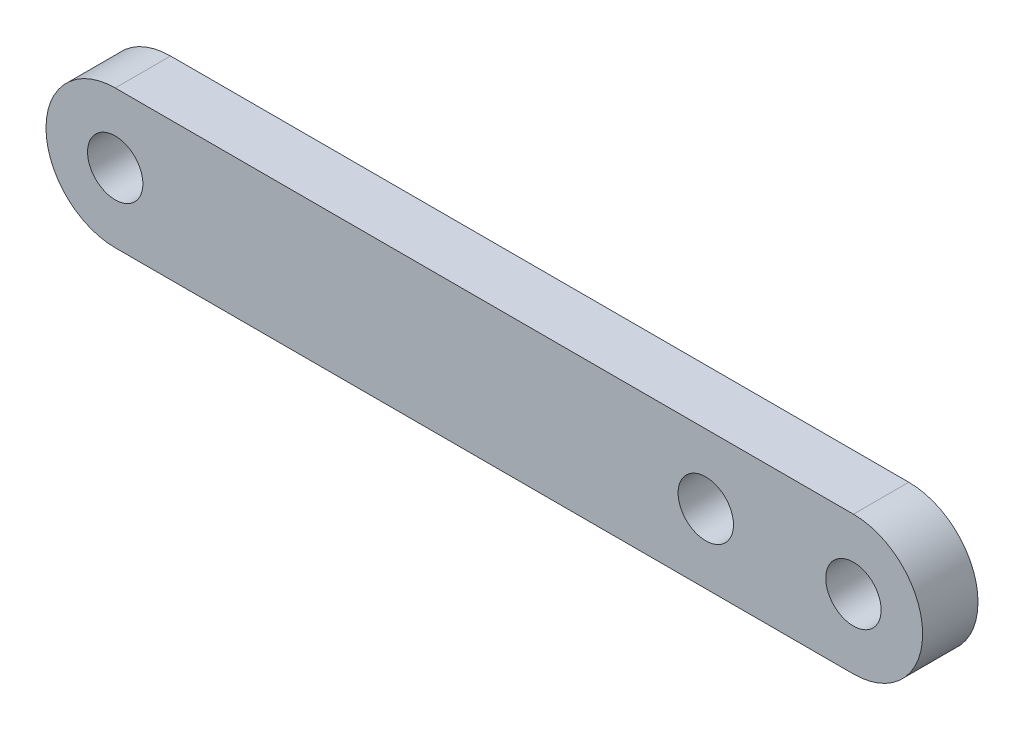
ISO-10303-21;
HEADER;
FILE_DESCRIPTION(('STEP AP214'),'2;1');
FILE_NAME('part.step','',(''),(''),'','','');
FILE_SCHEMA(('AUTOMOTIVE_DESIGN { 1 0 10303 214 1 1 1 1 }'));
ENDSEC;
DATA;
#1=APPLICATION_CONTEXT('core data for automotive mechanical design processes');
#2=APPLICATION_PROTOCOL_DEFINITION('international standard','automotive_design',2000,#1);
#3=PRODUCT_CONTEXT('',#1,'mechanical');
#4=PRODUCT('Part','Part','',(#3));
#5=PRODUCT_RELATED_PRODUCT_CATEGORY('part','',(#4));
#6=PRODUCT_DEFINITION_FORMATION('','',#4);
#7=PRODUCT_DEFINITION_CONTEXT('part definition',#1,'design');
#8=PRODUCT_DEFINITION('design','',#6,#7);
#9=PRODUCT_DEFINITION_SHAPE('','',#8);
#10=(LENGTH_UNIT() NAMED_UNIT(*) SI_UNIT(.MILLI.,.METRE.));
#11=(NAMED_UNIT(*) PLANE_ANGLE_UNIT() SI_UNIT($,.RADIAN.));
#12=(NAMED_UNIT(*) SI_UNIT($,.STERADIAN.) SOLID_ANGLE_UNIT());
#13=UNCERTAINTY_MEASURE_WITH_UNIT(LENGTH_MEASURE(1.E-05),#10,'distance_accuracy_value','');
#14=(GEOMETRIC_REPRESENTATION_CONTEXT(3) GLOBAL_UNCERTAINTY_ASSIGNED_CONTEXT((#13)) GLOBAL_UNIT_ASSIGNED_CONTEXT((#10,
#11,#12)) REPRESENTATION_CONTEXT('',''));
#15=CARTESIAN_POINT('',(0.,0.,0.));
#16=DIRECTION('',(0.,0.,1.));
#17=DIRECTION('',(1.,0.,0.));
#18=AXIS2_PLACEMENT_3D('',#15,#16,#17);
#19=CARTESIAN_POINT('',(0.,-3.75,3.));
#20=DIRECTION('',(0.,-1.,0.));
#21=DIRECTION('',(1.,0.,0.));
#22=AXIS2_PLACEMENT_3D('',#19,#20,#21);
#23=PLANE('',#22);
#24=DIRECTION('',(-1.,0.,0.));
#25=VECTOR('',#24,1.);
#26=CARTESIAN_POINT('',(0.,-3.75,0.));
#27=LINE('',#26,#25);
#28=CARTESIAN_POINT('',(40.,-3.75,0.));
#29=VERTEX_POINT('',#28);
#30=CARTESIAN_POINT('',(0.,-3.75,0.));
#31=VERTEX_POINT('',#30);
#32=EDGE_CURVE('E124',#29,#31,#27,.T.);
#33=ORIENTED_EDGE('',*,*,#32,.F.);
#34=DIRECTION('',(0.,0.,-1.));
#35=VECTOR('',#34,1.);
#36=CARTESIAN_POINT('',(40.,-3.75,3.));
#37=LINE('',#36,#35);
#38=CARTESIAN_POINT('',(40.,-3.75,3.));
#39=VERTEX_POINT('',#38);
#40=EDGE_CURVE('E11',#39,#29,#37,.T.);
#41=ORIENTED_EDGE('',*,*,#40,.F.);
#42=DIRECTION('',(-1.,0.,0.));
#43=VECTOR('',#42,1.);
#44=CARTESIAN_POINT('',(0.,-3.75,3.));
#45=LINE('',#44,#43);
#46=CARTESIAN_POINT('',(0.,-3.75,3.));
#47=VERTEX_POINT('',#46);
#48=EDGE_CURVE('E93',#39,#47,#45,.T.);
#49=ORIENTED_EDGE('',*,*,#48,.T.);
#50=DIRECTION('',(0.,0.,-1.));
#51=VECTOR('',#50,1.);
#52=CARTESIAN_POINT('',(0.,-3.75,3.));
#53=LINE('',#52,#51);
#54=EDGE_CURVE('E82',#47,#31,#53,.T.);
#55=ORIENTED_EDGE('',*,*,#54,.T.);
#56=EDGE_LOOP('',(#33,#41,#49,#55));
#57=FACE_BOUND('',#56,.T.);
#58=ADVANCED_FACE('F43',(#57),#23,.T.);
#59=CARTESIAN_POINT('',(40.,0.,3.));
#60=DIRECTION('',(0.,0.,-1.));
#61=DIRECTION('',(-1.,0.,0.));
#62=AXIS2_PLACEMENT_3D('',#59,#60,#61);
#63=CYLINDRICAL_SURFACE('',#62,3.75);
#64=CARTESIAN_POINT('',(40.,0.,0.));
#65=DIRECTION('',(0.,0.,1.));
#66=DIRECTION('',(1.,0.,0.));
#67=AXIS2_PLACEMENT_3D('',#64,#65,#66);
#68=CIRCLE('',#67,3.75);
#69=CARTESIAN_POINT('',(40.,3.75,0.));
#70=VERTEX_POINT('',#69);
#71=EDGE_CURVE('E100',#29,#70,#68,.T.);
#72=ORIENTED_EDGE('',*,*,#71,.T.);
#73=DIRECTION('',(0.,0.,-1.));
#74=VECTOR('',#73,1.);
#75=CARTESIAN_POINT('',(40.,3.75,3.));
#76=LINE('',#75,#74);
#77=CARTESIAN_POINT('',(40.,3.75,3.));
#78=VERTEX_POINT('',#77);
#79=EDGE_CURVE('E52',#78,#70,#76,.T.);
#80=ORIENTED_EDGE('',*,*,#79,.F.);
#81=CARTESIAN_POINT('',(40.,0.,3.));
#82=DIRECTION('',(0.,0.,1.));
#83=DIRECTION('',(1.,0.,0.));
#84=AXIS2_PLACEMENT_3D('',#81,#82,#83);
#85=CIRCLE('',#84,3.75);
#86=EDGE_CURVE('E87',#39,#78,#85,.T.);
#87=ORIENTED_EDGE('',*,*,#86,.F.);
#88=ORIENTED_EDGE('',*,*,#40,.T.);
#89=EDGE_LOOP('',(#72,#80,#87,#88));
#90=FACE_BOUND('',#89,.T.);
#91=ADVANCED_FACE('F98',(#90),#63,.T.);
#92=CARTESIAN_POINT('',(0.,3.75,3.));
#93=DIRECTION('',(0.,1.,0.));
#94=DIRECTION('',(-1.,0.,0.));
#95=AXIS2_PLACEMENT_3D('',#92,#93,#94);
#96=PLANE('',#95);
#97=DIRECTION('',(1.,0.,0.));
#98=VECTOR('',#97,1.);
#99=CARTESIAN_POINT('',(0.,3.75,0.));
#100=LINE('',#99,#98);
#101=CARTESIAN_POINT('',(0.,3.75,0.));
#102=VERTEX_POINT('',#101);
#103=EDGE_CURVE('E130',#102,#70,#100,.T.);
#104=ORIENTED_EDGE('',*,*,#103,.F.);
#105=DIRECTION('',(0.,0.,-1.));
#106=VECTOR('',#105,1.);
#107=CARTESIAN_POINT('',(0.,3.75,3.));
#108=LINE('',#107,#106);
#109=CARTESIAN_POINT('',(0.,3.75,3.));
#110=VERTEX_POINT('',#109);
#111=EDGE_CURVE('E75',#110,#102,#108,.T.);
#112=ORIENTED_EDGE('',*,*,#111,.F.);
#113=DIRECTION('',(1.,0.,0.));
#114=VECTOR('',#113,1.);
#115=CARTESIAN_POINT('',(0.,3.75,3.));
#116=LINE('',#115,#114);
#117=EDGE_CURVE('E92',#110,#78,#116,.T.);
#118=ORIENTED_EDGE('',*,*,#117,.T.);
#119=ORIENTED_EDGE('',*,*,#79,.T.);
#120=EDGE_LOOP('',(#104,#112,#118,#119));
#121=FACE_BOUND('',#120,.T.);
#122=ADVANCED_FACE('F105',(#121),#96,.T.);
#123=CARTESIAN_POINT('',(0.,0.,3.));
#124=DIRECTION('',(0.,0.,-1.));
#125=DIRECTION('',(-1.,0.,0.));
#126=AXIS2_PLACEMENT_3D('',#123,#124,#125);
#127=CYLINDRICAL_SURFACE('',#126,1.5);
#128=CARTESIAN_POINT('',(0.,0.,3.));
#129=DIRECTION('',(0.,0.,1.));
#130=DIRECTION('',(1.,0.,0.));
#131=AXIS2_PLACEMENT_3D('',#128,#129,#130);
#132=CIRCLE('',#131,1.5);
#133=CARTESIAN_POINT('',(1.5,0.,3.));
#134=VERTEX_POINT('',#133);
#135=EDGE_CURVE('E116',#134,#134,#132,.T.);
#136=ORIENTED_EDGE('',*,*,#135,.T.);
#137=EDGE_LOOP('',(#136));
#138=FACE_BOUND('',#137,.T.);
#139=CARTESIAN_POINT('',(0.,0.,0.));
#140=DIRECTION('',(0.,0.,1.));
#141=DIRECTION('',(1.,0.,0.));
#142=AXIS2_PLACEMENT_3D('',#139,#140,#141);
#143=CIRCLE('',#142,1.5);
#144=CARTESIAN_POINT('',(1.5,0.,0.));
#145=VERTEX_POINT('',#144);
#146=EDGE_CURVE('E140',#145,#145,#143,.T.);
#147=ORIENTED_EDGE('',*,*,#146,.F.);
#148=EDGE_LOOP('',(#147));
#149=FACE_BOUND('',#148,.T.);
#150=ADVANCED_FACE('F161',(#138,#149),#127,.F.);
#151=CARTESIAN_POINT('',(32.,0.,3.));
#152=DIRECTION('',(0.,0.,-1.));
#153=DIRECTION('',(-1.,0.,0.));
#154=AXIS2_PLACEMENT_3D('',#151,#152,#153);
#155=CYLINDRICAL_SURFACE('',#154,1.5);
#156=CARTESIAN_POINT('',(32.,0.,3.));
#157=DIRECTION('',(0.,0.,1.));
#158=DIRECTION('',(1.,0.,0.));
#159=AXIS2_PLACEMENT_3D('',#156,#157,#158);
#160=CIRCLE('',#159,1.5);
#161=CARTESIAN_POINT('',(33.5,0.,3.));
#162=VERTEX_POINT('',#161);
#163=EDGE_CURVE('E109',#162,#162,#160,.T.);
#164=ORIENTED_EDGE('',*,*,#163,.T.);
#165=EDGE_LOOP('',(#164));
#166=FACE_BOUND('',#165,.T.);
#167=CARTESIAN_POINT('',(32.,0.,0.));
#168=DIRECTION('',(0.,0.,1.));
#169=DIRECTION('',(1.,0.,0.));
#170=AXIS2_PLACEMENT_3D('',#167,#168,#169);
#171=CIRCLE('',#170,1.5);
#172=CARTESIAN_POINT('',(33.5,0.,0.));
#173=VERTEX_POINT('',#172);
#174=EDGE_CURVE('E136',#173,#173,#171,.T.);
#175=ORIENTED_EDGE('',*,*,#174,.F.);
#176=EDGE_LOOP('',(#175));
#177=FACE_BOUND('',#176,.T.);
#178=ADVANCED_FACE('F168',(#166,#177),#155,.F.);
#179=CARTESIAN_POINT('',(0.,0.,3.));
#180=DIRECTION('',(0.,0.,-1.));
#181=DIRECTION('',(-1.,0.,0.));
#182=AXIS2_PLACEMENT_3D('',#179,#180,#181);
#183=CYLINDRICAL_SURFACE('',#182,3.75);
#184=CARTESIAN_POINT('',(0.,0.,0.));
#185=DIRECTION('',(0.,0.,1.));
#186=DIRECTION('',(1.,0.,0.));
#187=AXIS2_PLACEMENT_3D('',#184,#185,#186);
#188=CIRCLE('',#187,3.75);
#189=EDGE_CURVE('E133',#102,#31,#188,.T.);
#190=ORIENTED_EDGE('',*,*,#189,.T.);
#191=ORIENTED_EDGE('',*,*,#54,.F.);
#192=CARTESIAN_POINT('',(0.,0.,3.));
#193=DIRECTION('',(0.,0.,1.));
#194=DIRECTION('',(1.,0.,0.));
#195=AXIS2_PLACEMENT_3D('',#192,#193,#194);
#196=CIRCLE('',#195,3.75);
#197=EDGE_CURVE('E60',#110,#47,#196,.T.);
#198=ORIENTED_EDGE('',*,*,#197,.F.);
#199=ORIENTED_EDGE('',*,*,#111,.T.);
#200=EDGE_LOOP('',(#190,#191,#198,#199));
#201=FACE_BOUND('',#200,.T.);
#202=ADVANCED_FACE('F164',(#201),#183,.T.);
#203=CARTESIAN_POINT('',(40.,0.,3.));
#204=DIRECTION('',(0.,0.,-1.));
#205=DIRECTION('',(-1.,0.,0.));
#206=AXIS2_PLACEMENT_3D('',#203,#204,#205);
#207=CYLINDRICAL_SURFACE('',#206,1.5);
#208=CARTESIAN_POINT('',(40.,0.,3.));
#209=DIRECTION('',(0.,0.,1.));
#210=DIRECTION('',(1.,0.,0.));
#211=AXIS2_PLACEMENT_3D('',#208,#209,#210);
#212=CIRCLE('',#211,1.5);
#213=CARTESIAN_POINT('',(41.5,0.,3.));
#214=VERTEX_POINT('',#213);
#215=EDGE_CURVE('E120',#214,#214,#212,.T.);
#216=ORIENTED_EDGE('',*,*,#215,.T.);
#217=EDGE_LOOP('',(#216));
#218=FACE_BOUND('',#217,.T.);
#219=CARTESIAN_POINT('',(40.,0.,0.));
#220=DIRECTION('',(0.,0.,1.));
#221=DIRECTION('',(1.,0.,0.));
#222=AXIS2_PLACEMENT_3D('',#219,#220,#221);
#223=CIRCLE('',#222,1.5);
#224=CARTESIAN_POINT('',(41.5,0.,0.));
#225=VERTEX_POINT('',#224);
#226=EDGE_CURVE('E144',#225,#225,#223,.T.);
#227=ORIENTED_EDGE('',*,*,#226,.F.);
#228=EDGE_LOOP('',(#227));
#229=FACE_BOUND('',#228,.T.);
#230=ADVANCED_FACE('F167',(#218,#229),#207,.F.);
#231=CARTESIAN_POINT('',(0.,0.,3.));
#232=DIRECTION('',(0.,0.,1.));
#233=DIRECTION('',(1.,0.,0.));
#234=AXIS2_PLACEMENT_3D('',#231,#232,#233);
#235=PLANE('',#234);
#236=ORIENTED_EDGE('',*,*,#48,.F.);
#237=ORIENTED_EDGE('',*,*,#86,.T.);
#238=ORIENTED_EDGE('',*,*,#117,.F.);
#239=ORIENTED_EDGE('',*,*,#197,.T.);
#240=EDGE_LOOP('',(#236,#237,#238,#239));
#241=FACE_BOUND('',#240,.T.);
#242=ORIENTED_EDGE('',*,*,#163,.F.);
#243=EDGE_LOOP('',(#242));
#244=FACE_BOUND('',#243,.T.);
#245=ORIENTED_EDGE('',*,*,#135,.F.);
#246=EDGE_LOOP('',(#245));
#247=FACE_BOUND('',#246,.T.);
#248=ORIENTED_EDGE('',*,*,#215,.F.);
#249=EDGE_LOOP('',(#248));
#250=FACE_BOUND('',#249,.T.);
#251=ADVANCED_FACE('F89',(#241,#244,#247,#250),#235,.T.);
#252=CARTESIAN_POINT('',(0.,0.,0.));
#253=DIRECTION('',(0.,0.,1.));
#254=DIRECTION('',(1.,0.,0.));
#255=AXIS2_PLACEMENT_3D('',#252,#253,#254);
#256=PLANE('',#255);
#257=ORIENTED_EDGE('',*,*,#32,.T.);
#258=ORIENTED_EDGE('',*,*,#189,.F.);
#259=ORIENTED_EDGE('',*,*,#103,.T.);
#260=ORIENTED_EDGE('',*,*,#71,.F.);
#261=EDGE_LOOP('',(#257,#258,#259,#260));
#262=FACE_BOUND('',#261,.T.);
#263=ORIENTED_EDGE('',*,*,#174,.T.);
#264=EDGE_LOOP('',(#263));
#265=FACE_BOUND('',#264,.T.);
#266=ORIENTED_EDGE('',*,*,#146,.T.);
#267=EDGE_LOOP('',(#266));
#268=FACE_BOUND('',#267,.T.);
#269=ORIENTED_EDGE('',*,*,#226,.T.);
#270=EDGE_LOOP('',(#269));
#271=FACE_BOUND('',#270,.T.);
#272=ADVANCED_FACE('F178',(#262,#265,#268,#271),#256,.F.);
#273=CLOSED_SHELL('',(#58,#91,#122,#150,#178,#202,#230,#251,#272));
#274=MANIFOLD_SOLID_BREP('B2',#273);
#275=ADVANCED_BREP_SHAPE_REPRESENTATION('',(#18,#274),#14);
#276=SHAPE_DEFINITION_REPRESENTATION(#9,#275);
ENDSEC;
END-ISO-10303-21;
